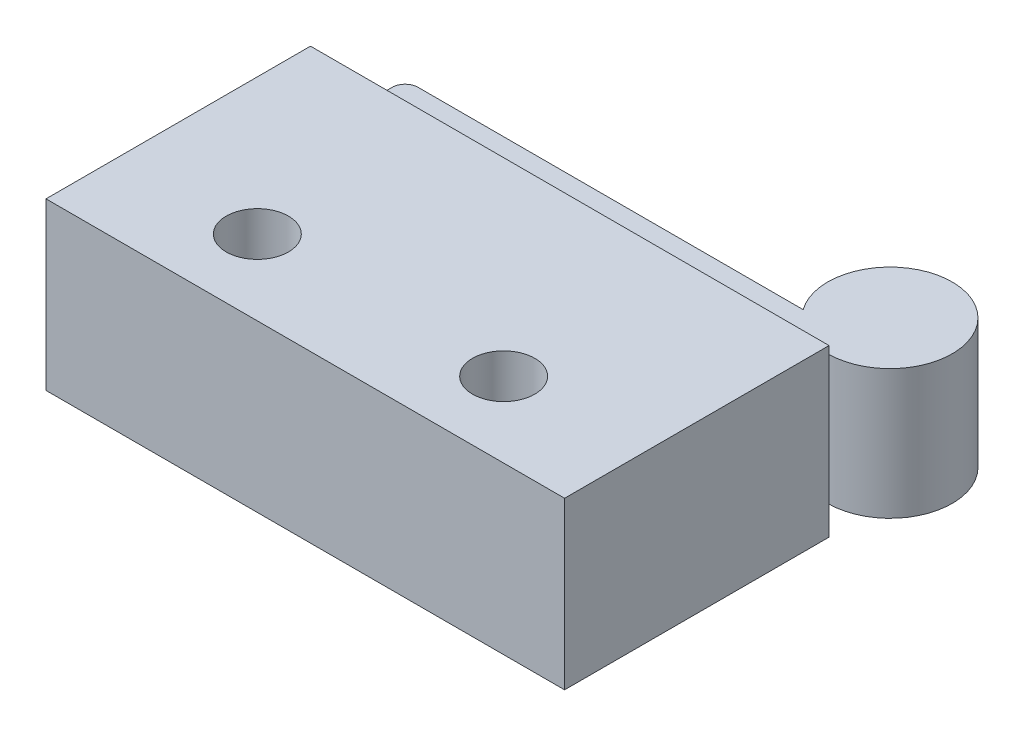
ISO-10303-21;
HEADER;
FILE_DESCRIPTION(('STEP AP214'),'2;1');
FILE_NAME('part.step','',(''),(''),'','','');
FILE_SCHEMA(('AUTOMOTIVE_DESIGN { 1 0 10303 214 1 1 1 1 }'));
ENDSEC;
DATA;
#1=APPLICATION_CONTEXT('core data for automotive mechanical design processes');
#2=APPLICATION_PROTOCOL_DEFINITION('international standard','automotive_design',2000,#1);
#3=PRODUCT_CONTEXT('',#1,'mechanical');
#4=PRODUCT('Part','Part','',(#3));
#5=PRODUCT_RELATED_PRODUCT_CATEGORY('part','',(#4));
#6=PRODUCT_DEFINITION_FORMATION('','',#4);
#7=PRODUCT_DEFINITION_CONTEXT('part definition',#1,'design');
#8=PRODUCT_DEFINITION('design','',#6,#7);
#9=PRODUCT_DEFINITION_SHAPE('','',#8);
#10=(LENGTH_UNIT() NAMED_UNIT(*) SI_UNIT(.MILLI.,.METRE.));
#11=(NAMED_UNIT(*) PLANE_ANGLE_UNIT() SI_UNIT($,.RADIAN.));
#12=(NAMED_UNIT(*) SI_UNIT($,.STERADIAN.) SOLID_ANGLE_UNIT());
#13=UNCERTAINTY_MEASURE_WITH_UNIT(LENGTH_MEASURE(1.E-05),#10,'distance_accuracy_value','');
#14=(GEOMETRIC_REPRESENTATION_CONTEXT(3) GLOBAL_UNCERTAINTY_ASSIGNED_CONTEXT((#13)) GLOBAL_UNIT_ASSIGNED_CONTEXT((#10,
#11,#12)) REPRESENTATION_CONTEXT('',''));
#15=CARTESIAN_POINT('',(0.,0.,0.));
#16=DIRECTION('',(0.,0.,1.));
#17=DIRECTION('',(1.,0.,0.));
#18=AXIS2_PLACEMENT_3D('',#15,#16,#17);
#19=CARTESIAN_POINT('',(0.,6.4,0.));
#20=DIRECTION('',(0.,-1.,0.));
#21=DIRECTION('',(0.,0.,-1.));
#22=AXIS2_PLACEMENT_3D('',#19,#20,#21);
#23=PLANE('',#22);
#24=DIRECTION('',(0.,0.,-1.));
#25=VECTOR('',#24,1.);
#26=CARTESIAN_POINT('',(10.,6.4,5.1));
#27=LINE('',#26,#25);
#28=CARTESIAN_POINT('',(10.,6.4,5.1));
#29=VERTEX_POINT('',#28);
#30=CARTESIAN_POINT('',(10.,6.4,-5.1));
#31=VERTEX_POINT('',#30);
#32=EDGE_CURVE('E207',#29,#31,#27,.T.);
#33=ORIENTED_EDGE('',*,*,#32,.T.);
#34=DIRECTION('',(-1.,0.,0.));
#35=VECTOR('',#34,1.);
#36=CARTESIAN_POINT('',(-10.,6.4,-5.1));
#37=LINE('',#36,#35);
#38=CARTESIAN_POINT('',(-10.,6.4,-5.1));
#39=VERTEX_POINT('',#38);
#40=EDGE_CURVE('E211',#31,#39,#37,.T.);
#41=ORIENTED_EDGE('',*,*,#40,.T.);
#42=DIRECTION('',(0.,0.,1.));
#43=VECTOR('',#42,1.);
#44=CARTESIAN_POINT('',(-10.,6.4,5.1));
#45=LINE('',#44,#43);
#46=CARTESIAN_POINT('',(-10.,6.4,5.1));
#47=VERTEX_POINT('',#46);
#48=EDGE_CURVE('E215',#39,#47,#45,.T.);
#49=ORIENTED_EDGE('',*,*,#48,.T.);
#50=DIRECTION('',(1.,0.,0.));
#51=VECTOR('',#50,1.);
#52=CARTESIAN_POINT('',(-10.,6.4,5.1));
#53=LINE('',#52,#51);
#54=EDGE_CURVE('E218',#47,#29,#53,.T.);
#55=ORIENTED_EDGE('',*,*,#54,.T.);
#56=EDGE_LOOP('',(#33,#41,#49,#55));
#57=FACE_BOUND('',#56,.T.);
#58=CARTESIAN_POINT('',(-4.75,6.4,2.2));
#59=DIRECTION('',(0.,1.,0.));
#60=DIRECTION('',(0.,0.,1.));
#61=AXIS2_PLACEMENT_3D('',#58,#59,#60);
#62=CIRCLE('',#61,1.2);
#63=CARTESIAN_POINT('',(-4.75,6.4,3.4));
#64=VERTEX_POINT('',#63);
#65=EDGE_CURVE('E199',#64,#64,#62,.T.);
#66=ORIENTED_EDGE('',*,*,#65,.F.);
#67=EDGE_LOOP('',(#66));
#68=FACE_BOUND('',#67,.T.);
#69=CARTESIAN_POINT('',(4.75,6.4,2.2));
#70=DIRECTION('',(0.,1.,0.));
#71=DIRECTION('',(0.,0.,1.));
#72=AXIS2_PLACEMENT_3D('',#69,#70,#71);
#73=CIRCLE('',#72,1.2);
#74=CARTESIAN_POINT('',(4.75,6.4,3.4));
#75=VERTEX_POINT('',#74);
#76=EDGE_CURVE('E191',#75,#75,#73,.T.);
#77=ORIENTED_EDGE('',*,*,#76,.F.);
#78=EDGE_LOOP('',(#77));
#79=FACE_BOUND('',#78,.T.);
#80=ADVANCED_FACE('F45',(#57,#68,#79),#23,.F.);
#81=CARTESIAN_POINT('',(0.,0.,0.));
#82=DIRECTION('',(0.,-1.,0.));
#83=DIRECTION('',(0.,0.,-1.));
#84=AXIS2_PLACEMENT_3D('',#81,#82,#83);
#85=PLANE('',#84);
#86=CARTESIAN_POINT('',(-4.75,0.,2.2));
#87=DIRECTION('',(0.,1.,0.));
#88=DIRECTION('',(0.,0.,1.));
#89=AXIS2_PLACEMENT_3D('',#86,#87,#88);
#90=CIRCLE('',#89,1.2);
#91=CARTESIAN_POINT('',(-4.75,0.,3.4));
#92=VERTEX_POINT('',#91);
#93=EDGE_CURVE('E195',#92,#92,#90,.T.);
#94=ORIENTED_EDGE('',*,*,#93,.T.);
#95=EDGE_LOOP('',(#94));
#96=FACE_BOUND('',#95,.T.);
#97=DIRECTION('',(0.,0.,-1.));
#98=VECTOR('',#97,1.);
#99=CARTESIAN_POINT('',(10.,0.,5.1));
#100=LINE('',#99,#98);
#101=CARTESIAN_POINT('',(10.,0.,5.1));
#102=VERTEX_POINT('',#101);
#103=CARTESIAN_POINT('',(10.,0.,-5.1));
#104=VERTEX_POINT('',#103);
#105=EDGE_CURVE('E203',#102,#104,#100,.T.);
#106=ORIENTED_EDGE('',*,*,#105,.F.);
#107=DIRECTION('',(1.,0.,0.));
#108=VECTOR('',#107,1.);
#109=CARTESIAN_POINT('',(-10.,0.,5.1));
#110=LINE('',#109,#108);
#111=CARTESIAN_POINT('',(-10.,0.,5.1));
#112=VERTEX_POINT('',#111);
#113=EDGE_CURVE('E212',#112,#102,#110,.T.);
#114=ORIENTED_EDGE('',*,*,#113,.F.);
#115=DIRECTION('',(0.,0.,1.));
#116=VECTOR('',#115,1.);
#117=CARTESIAN_POINT('',(-10.,0.,5.1));
#118=LINE('',#117,#116);
#119=CARTESIAN_POINT('',(-10.,0.,-5.1));
#120=VERTEX_POINT('',#119);
#121=EDGE_CURVE('E228',#120,#112,#118,.T.);
#122=ORIENTED_EDGE('',*,*,#121,.F.);
#123=DIRECTION('',(-1.,0.,0.));
#124=VECTOR('',#123,1.);
#125=CARTESIAN_POINT('',(-10.,0.,-5.1));
#126=LINE('',#125,#124);
#127=EDGE_CURVE('E225',#104,#120,#126,.T.);
#128=ORIENTED_EDGE('',*,*,#127,.F.);
#129=EDGE_LOOP('',(#106,#114,#122,#128));
#130=FACE_BOUND('',#129,.T.);
#131=CARTESIAN_POINT('',(4.75,0.,2.2));
#132=DIRECTION('',(0.,1.,0.));
#133=DIRECTION('',(0.,0.,1.));
#134=AXIS2_PLACEMENT_3D('',#131,#132,#133);
#135=CIRCLE('',#134,1.2);
#136=CARTESIAN_POINT('',(4.75,0.,3.4));
#137=VERTEX_POINT('',#136);
#138=EDGE_CURVE('E190',#137,#137,#135,.T.);
#139=ORIENTED_EDGE('',*,*,#138,.T.);
#140=EDGE_LOOP('',(#139));
#141=FACE_BOUND('',#140,.T.);
#142=ADVANCED_FACE('F280',(#96,#130,#141),#85,.T.);
#143=CARTESIAN_POINT('',(10.,6.4,5.1));
#144=DIRECTION('',(-1.,0.,0.));
#145=DIRECTION('',(0.,0.,1.));
#146=AXIS2_PLACEMENT_3D('',#143,#144,#145);
#147=PLANE('',#146);
#148=ORIENTED_EDGE('',*,*,#105,.T.);
#149=DIRECTION('',(0.,-1.,0.));
#150=VECTOR('',#149,1.);
#151=CARTESIAN_POINT('',(10.,6.4,-5.1));
#152=LINE('',#151,#150);
#153=EDGE_CURVE('E244',#31,#104,#152,.T.);
#154=ORIENTED_EDGE('',*,*,#153,.F.);
#155=ORIENTED_EDGE('',*,*,#32,.F.);
#156=DIRECTION('',(0.,-1.,0.));
#157=VECTOR('',#156,1.);
#158=CARTESIAN_POINT('',(10.,6.4,5.1));
#159=LINE('',#158,#157);
#160=EDGE_CURVE('E221',#29,#102,#159,.T.);
#161=ORIENTED_EDGE('',*,*,#160,.T.);
#162=EDGE_LOOP('',(#148,#154,#155,#161));
#163=FACE_BOUND('',#162,.T.);
#164=ADVANCED_FACE('F286',(#163),#147,.F.);
#165=CARTESIAN_POINT('',(-10.,6.4,-5.1));
#166=DIRECTION('',(0.,0.,1.));
#167=DIRECTION('',(1.,0.,0.));
#168=AXIS2_PLACEMENT_3D('',#165,#166,#167);
#169=PLANE('',#168);
#170=DIRECTION('',(0.,-1.,0.));
#171=VECTOR('',#170,1.);
#172=CARTESIAN_POINT('',(-6.75,5.7,-5.1));
#173=LINE('',#172,#171);
#174=CARTESIAN_POINT('',(-6.75,5.7,-5.1));
#175=VERTEX_POINT('',#174);
#176=CARTESIAN_POINT('',(-6.75,0.7,-5.1));
#177=VERTEX_POINT('',#176);
#178=EDGE_CURVE('E151',#175,#177,#173,.T.);
#179=ORIENTED_EDGE('',*,*,#178,.F.);
#180=DIRECTION('',(1.,0.,0.));
#181=VECTOR('',#180,1.);
#182=CARTESIAN_POINT('',(-7.75,5.7,-5.1));
#183=LINE('',#182,#181);
#184=CARTESIAN_POINT('',(-7.75,5.7,-5.1));
#185=VERTEX_POINT('',#184);
#186=EDGE_CURVE('E141',#185,#175,#183,.T.);
#187=ORIENTED_EDGE('',*,*,#186,.F.);
#188=DIRECTION('',(0.,-1.,0.));
#189=VECTOR('',#188,1.);
#190=CARTESIAN_POINT('',(-7.75,5.7,-5.1));
#191=LINE('',#190,#189);
#192=CARTESIAN_POINT('',(-7.75,0.7,-5.1));
#193=VERTEX_POINT('',#192);
#194=EDGE_CURVE('E166',#185,#193,#191,.T.);
#195=ORIENTED_EDGE('',*,*,#194,.T.);
#196=DIRECTION('',(1.,0.,0.));
#197=VECTOR('',#196,1.);
#198=CARTESIAN_POINT('',(-7.75,0.7,-5.1));
#199=LINE('',#198,#197);
#200=EDGE_CURVE('E167',#193,#177,#199,.T.);
#201=ORIENTED_EDGE('',*,*,#200,.T.);
#202=EDGE_LOOP('',(#179,#187,#195,#201));
#203=FACE_BOUND('',#202,.T.);
#204=ORIENTED_EDGE('',*,*,#127,.T.);
#205=DIRECTION('',(0.,-1.,0.));
#206=VECTOR('',#205,1.);
#207=CARTESIAN_POINT('',(-10.,6.4,-5.1));
#208=LINE('',#207,#206);
#209=EDGE_CURVE('E240',#39,#120,#208,.T.);
#210=ORIENTED_EDGE('',*,*,#209,.F.);
#211=ORIENTED_EDGE('',*,*,#40,.F.);
#212=ORIENTED_EDGE('',*,*,#153,.T.);
#213=EDGE_LOOP('',(#204,#210,#211,#212));
#214=FACE_BOUND('',#213,.T.);
#215=ADVANCED_FACE('F266',(#203,#214),#169,.F.);
#216=CARTESIAN_POINT('',(-10.,6.4,5.1));
#217=DIRECTION('',(1.,0.,0.));
#218=DIRECTION('',(0.,0.,-1.));
#219=AXIS2_PLACEMENT_3D('',#216,#217,#218);
#220=PLANE('',#219);
#221=ORIENTED_EDGE('',*,*,#121,.T.);
#222=DIRECTION('',(0.,-1.,0.));
#223=VECTOR('',#222,1.);
#224=CARTESIAN_POINT('',(-10.,6.4,5.1));
#225=LINE('',#224,#223);
#226=EDGE_CURVE('E236',#47,#112,#225,.T.);
#227=ORIENTED_EDGE('',*,*,#226,.F.);
#228=ORIENTED_EDGE('',*,*,#48,.F.);
#229=ORIENTED_EDGE('',*,*,#209,.T.);
#230=EDGE_LOOP('',(#221,#227,#228,#229));
#231=FACE_BOUND('',#230,.T.);
#232=ADVANCED_FACE('F297',(#231),#220,.F.);
#233=CARTESIAN_POINT('',(-10.,6.4,5.1));
#234=DIRECTION('',(0.,0.,-1.));
#235=DIRECTION('',(-1.,0.,0.));
#236=AXIS2_PLACEMENT_3D('',#233,#234,#235);
#237=PLANE('',#236);
#238=ORIENTED_EDGE('',*,*,#113,.T.);
#239=ORIENTED_EDGE('',*,*,#160,.F.);
#240=ORIENTED_EDGE('',*,*,#54,.F.);
#241=ORIENTED_EDGE('',*,*,#226,.T.);
#242=EDGE_LOOP('',(#238,#239,#240,#241));
#243=FACE_BOUND('',#242,.T.);
#244=ADVANCED_FACE('F294',(#243),#237,.F.);
#245=CARTESIAN_POINT('',(-4.75,6.4,2.2));
#246=DIRECTION('',(0.,-1.,0.));
#247=DIRECTION('',(0.,0.,-1.));
#248=AXIS2_PLACEMENT_3D('',#245,#246,#247);
#249=CYLINDRICAL_SURFACE('',#248,1.2);
#250=ORIENTED_EDGE('',*,*,#65,.T.);
#251=EDGE_LOOP('',(#250));
#252=FACE_BOUND('',#251,.T.);
#253=ORIENTED_EDGE('',*,*,#93,.F.);
#254=EDGE_LOOP('',(#253));
#255=FACE_BOUND('',#254,.T.);
#256=ADVANCED_FACE('F291',(#252,#255),#249,.F.);
#257=CARTESIAN_POINT('',(4.75,6.4,2.2));
#258=DIRECTION('',(0.,-1.,0.));
#259=DIRECTION('',(0.,0.,-1.));
#260=AXIS2_PLACEMENT_3D('',#257,#258,#259);
#261=CYLINDRICAL_SURFACE('',#260,1.2);
#262=ORIENTED_EDGE('',*,*,#76,.T.);
#263=EDGE_LOOP('',(#262));
#264=FACE_BOUND('',#263,.T.);
#265=ORIENTED_EDGE('',*,*,#138,.F.);
#266=EDGE_LOOP('',(#265));
#267=FACE_BOUND('',#266,.T.);
#268=ADVANCED_FACE('F321',(#264,#267),#261,.F.);
#269=CARTESIAN_POINT('',(-6.75,5.7,-5.5));
#270=DIRECTION('',(0.,0.,-1.));
#271=DIRECTION('',(-1.,0.,0.));
#272=AXIS2_PLACEMENT_3D('',#269,#270,#271);
#273=PLANE('',#272);
#274=DIRECTION('',(1.,0.,0.));
#275=VECTOR('',#274,1.);
#276=CARTESIAN_POINT('',(-6.75,5.7,-5.5));
#277=LINE('',#276,#275);
#278=CARTESIAN_POINT('',(-6.26010205144336,5.7,-5.5));
#279=VERTEX_POINT('',#278);
#280=CARTESIAN_POINT('',(9.55,5.7,-5.5));
#281=VERTEX_POINT('',#280);
#282=EDGE_CURVE('E129',#279,#281,#277,.T.);
#283=ORIENTED_EDGE('',*,*,#282,.F.);
#284=DIRECTION('',(0.,1.,0.));
#285=VECTOR('',#284,1.);
#286=CARTESIAN_POINT('',(-6.26010205144336,5.7,-5.5));
#287=LINE('',#286,#285);
#288=CARTESIAN_POINT('',(-6.26010205144336,0.7,-5.5));
#289=VERTEX_POINT('',#288);
#290=EDGE_CURVE('E248',#279,#289,#287,.F.);
#291=ORIENTED_EDGE('',*,*,#290,.T.);
#292=DIRECTION('',(1.,0.,0.));
#293=VECTOR('',#292,1.);
#294=CARTESIAN_POINT('',(-6.75,0.7,-5.5));
#295=LINE('',#294,#293);
#296=CARTESIAN_POINT('',(9.55,0.7,-5.5));
#297=VERTEX_POINT('',#296);
#298=EDGE_CURVE('E147',#289,#297,#295,.T.);
#299=ORIENTED_EDGE('',*,*,#298,.T.);
#300=DIRECTION('',(0.,-1.,0.));
#301=VECTOR('',#300,1.);
#302=CARTESIAN_POINT('',(9.55,5.7,-5.5));
#303=LINE('',#302,#301);
#304=EDGE_CURVE('E144',#281,#297,#303,.T.);
#305=ORIENTED_EDGE('',*,*,#304,.F.);
#306=EDGE_LOOP('',(#283,#291,#299,#305));
#307=FACE_BOUND('',#306,.T.);
#308=ADVANCED_FACE('F145',(#307),#273,.F.);
#309=CARTESIAN_POINT('',(9.55,5.7,-7.9));
#310=DIRECTION('',(0.,-1.,0.));
#311=DIRECTION('',(0.,0.,-1.));
#312=AXIS2_PLACEMENT_3D('',#309,#310,#311);
#313=CYLINDRICAL_SURFACE('',#312,2.4);
#314=CARTESIAN_POINT('',(9.55,0.7,-7.9));
#315=DIRECTION('',(0.,1.,0.));
#316=DIRECTION('',(0.,0.,1.));
#317=AXIS2_PLACEMENT_3D('',#314,#315,#316);
#318=CIRCLE('',#317,2.4);
#319=CARTESIAN_POINT('',(7.60064113103821,0.7,-6.5));
#320=VERTEX_POINT('',#319);
#321=EDGE_CURVE('E173',#297,#320,#318,.T.);
#322=ORIENTED_EDGE('',*,*,#321,.T.);
#323=DIRECTION('',(0.,-1.,0.));
#324=VECTOR('',#323,1.);
#325=CARTESIAN_POINT('',(7.60064113103821,5.7,-6.5));
#326=LINE('',#325,#324);
#327=CARTESIAN_POINT('',(7.60064113103821,5.7,-6.5));
#328=VERTEX_POINT('',#327);
#329=EDGE_CURVE('E152',#328,#320,#326,.T.);
#330=ORIENTED_EDGE('',*,*,#329,.F.);
#331=CARTESIAN_POINT('',(9.55,5.7,-7.9));
#332=DIRECTION('',(0.,1.,0.));
#333=DIRECTION('',(0.,0.,1.));
#334=AXIS2_PLACEMENT_3D('',#331,#332,#333);
#335=CIRCLE('',#334,2.4);
#336=EDGE_CURVE('E133',#281,#328,#335,.T.);
#337=ORIENTED_EDGE('',*,*,#336,.F.);
#338=ORIENTED_EDGE('',*,*,#304,.T.);
#339=EDGE_LOOP('',(#322,#330,#337,#338));
#340=FACE_BOUND('',#339,.T.);
#341=ADVANCED_FACE('F154',(#340),#313,.T.);
#342=CARTESIAN_POINT('',(7.60064113103821,5.7,-6.5));
#343=DIRECTION('',(0.,0.,1.));
#344=DIRECTION('',(1.,0.,0.));
#345=AXIS2_PLACEMENT_3D('',#342,#343,#344);
#346=PLANE('',#345);
#347=DIRECTION('',(-1.,0.,0.));
#348=VECTOR('',#347,1.);
#349=CARTESIAN_POINT('',(7.60064113103821,0.7,-6.5));
#350=LINE('',#349,#348);
#351=CARTESIAN_POINT('',(-7.25,0.7,-6.5));
#352=VERTEX_POINT('',#351);
#353=EDGE_CURVE('E176',#320,#352,#350,.T.);
#354=ORIENTED_EDGE('',*,*,#353,.T.);
#355=DIRECTION('',(0.,-1.,0.));
#356=VECTOR('',#355,1.);
#357=CARTESIAN_POINT('',(-7.25,5.7,-6.5));
#358=LINE('',#357,#356);
#359=CARTESIAN_POINT('',(-7.25,5.7,-6.5));
#360=VERTEX_POINT('',#359);
#361=EDGE_CURVE('E61',#352,#360,#358,.F.);
#362=ORIENTED_EDGE('',*,*,#361,.T.);
#363=DIRECTION('',(-1.,0.,0.));
#364=VECTOR('',#363,1.);
#365=CARTESIAN_POINT('',(7.60064113103821,5.7,-6.5));
#366=LINE('',#365,#364);
#367=EDGE_CURVE('E157',#328,#360,#366,.T.);
#368=ORIENTED_EDGE('',*,*,#367,.F.);
#369=ORIENTED_EDGE('',*,*,#329,.T.);
#370=EDGE_LOOP('',(#354,#362,#368,#369));
#371=FACE_BOUND('',#370,.T.);
#372=ADVANCED_FACE('F333',(#371),#346,.F.);
#373=CARTESIAN_POINT('',(-7.75,5.7,-6.5));
#374=DIRECTION('',(1.,0.,0.));
#375=DIRECTION('',(0.,0.,-1.));
#376=AXIS2_PLACEMENT_3D('',#373,#374,#375);
#377=PLANE('',#376);
#378=DIRECTION('',(0.,0.,1.));
#379=VECTOR('',#378,1.);
#380=CARTESIAN_POINT('',(-7.75,5.7,-6.5));
#381=LINE('',#380,#379);
#382=CARTESIAN_POINT('',(-7.75,5.7,-6.));
#383=VERTEX_POINT('',#382);
#384=EDGE_CURVE('E160',#383,#185,#381,.T.);
#385=ORIENTED_EDGE('',*,*,#384,.F.);
#386=DIRECTION('',(0.,-1.,0.));
#387=VECTOR('',#386,1.);
#388=CARTESIAN_POINT('',(-7.75,5.7,-6.));
#389=LINE('',#388,#387);
#390=CARTESIAN_POINT('',(-7.75,0.7,-6.));
#391=VERTEX_POINT('',#390);
#392=EDGE_CURVE('E251',#383,#391,#389,.T.);
#393=ORIENTED_EDGE('',*,*,#392,.T.);
#394=DIRECTION('',(0.,0.,1.));
#395=VECTOR('',#394,1.);
#396=CARTESIAN_POINT('',(-7.75,0.7,-6.5));
#397=LINE('',#396,#395);
#398=EDGE_CURVE('E179',#391,#193,#397,.T.);
#399=ORIENTED_EDGE('',*,*,#398,.T.);
#400=ORIENTED_EDGE('',*,*,#194,.F.);
#401=EDGE_LOOP('',(#385,#393,#399,#400));
#402=FACE_BOUND('',#401,.T.);
#403=ADVANCED_FACE('F336',(#402),#377,.F.);
#404=CARTESIAN_POINT('',(9.55,5.7,-7.9));
#405=DIRECTION('',(0.,1.,0.));
#406=DIRECTION('',(0.,0.,1.));
#407=AXIS2_PLACEMENT_3D('',#404,#405,#406);
#408=PLANE('',#407);
#409=ORIENTED_EDGE('',*,*,#367,.T.);
#410=CARTESIAN_POINT('',(-7.25,5.7,-6.));
#411=DIRECTION('',(0.,1.,0.));
#412=DIRECTION('',(0.,0.,1.));
#413=AXIS2_PLACEMENT_3D('',#410,#411,#412);
#414=CIRCLE('',#413,0.5);
#415=EDGE_CURVE('E259',#360,#383,#414,.T.);
#416=ORIENTED_EDGE('',*,*,#415,.T.);
#417=ORIENTED_EDGE('',*,*,#384,.T.);
#418=ORIENTED_EDGE('',*,*,#186,.T.);
#419=CARTESIAN_POINT('',(-6.26010205144336,5.7,-5.));
#420=DIRECTION('',(0.,1.,0.));
#421=DIRECTION('',(0.,0.,1.));
#422=AXIS2_PLACEMENT_3D('',#419,#420,#421);
#423=CIRCLE('',#422,0.5);
#424=EDGE_CURVE('E11',#175,#279,#423,.F.);
#425=ORIENTED_EDGE('',*,*,#424,.T.);
#426=ORIENTED_EDGE('',*,*,#282,.T.);
#427=ORIENTED_EDGE('',*,*,#336,.T.);
#428=EDGE_LOOP('',(#409,#416,#417,#418,#425,#426,#427));
#429=FACE_BOUND('',#428,.T.);
#430=ADVANCED_FACE('F131',(#429),#408,.T.);
#431=CARTESIAN_POINT('',(9.55,0.7,-7.9));
#432=DIRECTION('',(0.,1.,0.));
#433=DIRECTION('',(0.,0.,1.));
#434=AXIS2_PLACEMENT_3D('',#431,#432,#433);
#435=PLANE('',#434);
#436=ORIENTED_EDGE('',*,*,#398,.F.);
#437=CARTESIAN_POINT('',(-7.25,0.7,-6.));
#438=DIRECTION('',(0.,1.,0.));
#439=DIRECTION('',(0.,0.,1.));
#440=AXIS2_PLACEMENT_3D('',#437,#438,#439);
#441=CIRCLE('',#440,0.5);
#442=EDGE_CURVE('E69',#391,#352,#441,.F.);
#443=ORIENTED_EDGE('',*,*,#442,.T.);
#444=ORIENTED_EDGE('',*,*,#353,.F.);
#445=ORIENTED_EDGE('',*,*,#321,.F.);
#446=ORIENTED_EDGE('',*,*,#298,.F.);
#447=CARTESIAN_POINT('',(-6.26010205144336,0.7,-5.));
#448=DIRECTION('',(0.,1.,0.));
#449=DIRECTION('',(0.,0.,1.));
#450=AXIS2_PLACEMENT_3D('',#447,#448,#449);
#451=CIRCLE('',#450,0.5);
#452=EDGE_CURVE('E54',#289,#177,#451,.T.);
#453=ORIENTED_EDGE('',*,*,#452,.T.);
#454=ORIENTED_EDGE('',*,*,#200,.F.);
#455=EDGE_LOOP('',(#436,#443,#444,#445,#446,#453,#454));
#456=FACE_BOUND('',#455,.T.);
#457=ADVANCED_FACE('F263',(#456),#435,.F.);
#458=CARTESIAN_POINT('',(-6.26010205144336,5.7,-5.));
#459=DIRECTION('',(0.,1.,0.));
#460=DIRECTION('',(0.,0.,1.));
#461=AXIS2_PLACEMENT_3D('',#458,#459,#460);
#462=CYLINDRICAL_SURFACE('',#461,0.5);
#463=ORIENTED_EDGE('',*,*,#424,.F.);
#464=ORIENTED_EDGE('',*,*,#178,.T.);
#465=ORIENTED_EDGE('',*,*,#452,.F.);
#466=ORIENTED_EDGE('',*,*,#290,.F.);
#467=EDGE_LOOP('',(#463,#464,#465,#466));
#468=FACE_BOUND('',#467,.T.);
#469=ADVANCED_FACE('F270',(#468),#462,.F.);
#470=CARTESIAN_POINT('',(-7.25,5.7,-6.));
#471=DIRECTION('',(0.,-1.,0.));
#472=DIRECTION('',(0.,0.,-1.));
#473=AXIS2_PLACEMENT_3D('',#470,#471,#472);
#474=CYLINDRICAL_SURFACE('',#473,0.5);
#475=ORIENTED_EDGE('',*,*,#415,.F.);
#476=ORIENTED_EDGE('',*,*,#361,.F.);
#477=ORIENTED_EDGE('',*,*,#442,.F.);
#478=ORIENTED_EDGE('',*,*,#392,.F.);
#479=EDGE_LOOP('',(#475,#476,#477,#478));
#480=FACE_BOUND('',#479,.T.);
#481=ADVANCED_FACE('F47',(#480),#474,.T.);
#482=CLOSED_SHELL('',(#80,#142,#164,#215,#232,#244,#256,#268,#308,#341,#372,#403,#430,#457,#469,#481));
#483=MANIFOLD_SOLID_BREP('B2',#482);
#484=ADVANCED_BREP_SHAPE_REPRESENTATION('',(#18,#483),#14);
#485=SHAPE_DEFINITION_REPRESENTATION(#9,#484);
ENDSEC;
END-ISO-10303-21;
